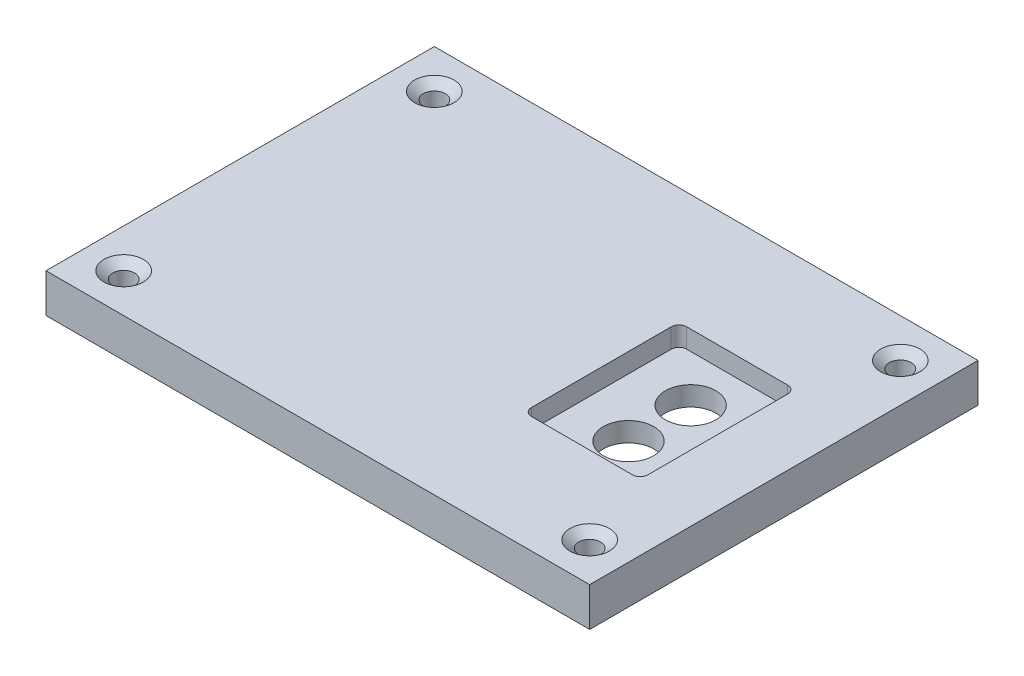
ISO-10303-21;
HEADER;
FILE_DESCRIPTION(('STEP AP214'),'2;1');
FILE_NAME('part.step','',(''),(''),'','','');
FILE_SCHEMA(('AUTOMOTIVE_DESIGN { 1 0 10303 214 1 1 1 1 }'));
ENDSEC;
DATA;
#1=APPLICATION_CONTEXT('core data for automotive mechanical design processes');
#2=APPLICATION_PROTOCOL_DEFINITION('international standard','automotive_design',2000,#1);
#3=PRODUCT_CONTEXT('',#1,'mechanical');
#4=PRODUCT('Part','Part','',(#3));
#5=PRODUCT_RELATED_PRODUCT_CATEGORY('part','',(#4));
#6=PRODUCT_DEFINITION_FORMATION('','',#4);
#7=PRODUCT_DEFINITION_CONTEXT('part definition',#1,'design');
#8=PRODUCT_DEFINITION('design','',#6,#7);
#9=PRODUCT_DEFINITION_SHAPE('','',#8);
#10=(LENGTH_UNIT() NAMED_UNIT(*) SI_UNIT(.MILLI.,.METRE.));
#11=(NAMED_UNIT(*) PLANE_ANGLE_UNIT() SI_UNIT($,.RADIAN.));
#12=(NAMED_UNIT(*) SI_UNIT($,.STERADIAN.) SOLID_ANGLE_UNIT());
#13=UNCERTAINTY_MEASURE_WITH_UNIT(LENGTH_MEASURE(1.E-05),#10,'distance_accuracy_value','');
#14=(GEOMETRIC_REPRESENTATION_CONTEXT(3) GLOBAL_UNCERTAINTY_ASSIGNED_CONTEXT((#13)) GLOBAL_UNIT_ASSIGNED_CONTEXT((#10,
#11,#12)) REPRESENTATION_CONTEXT('',''));
#15=CARTESIAN_POINT('',(0.,0.,0.));
#16=DIRECTION('',(0.,0.,1.));
#17=DIRECTION('',(1.,0.,0.));
#18=AXIS2_PLACEMENT_3D('',#15,#16,#17);
#19=CARTESIAN_POINT('',(0.,12.7,0.));
#20=DIRECTION('',(0.,-1.,0.));
#21=DIRECTION('',(0.,0.,-1.));
#22=AXIS2_PLACEMENT_3D('',#19,#20,#21);
#23=PLANE('',#22);
#24=DIRECTION('',(0.,0.,-1.));
#25=VECTOR('',#24,1.);
#26=CARTESIAN_POINT('',(88.9,12.7,63.5));
#27=LINE('',#26,#25);
#28=CARTESIAN_POINT('',(88.9,12.7,63.5));
#29=VERTEX_POINT('',#28);
#30=CARTESIAN_POINT('',(88.9,12.7,-63.5));
#31=VERTEX_POINT('',#30);
#32=EDGE_CURVE('E133',#29,#31,#27,.T.);
#33=ORIENTED_EDGE('',*,*,#32,.T.);
#34=DIRECTION('',(-1.,0.,0.));
#35=VECTOR('',#34,1.);
#36=CARTESIAN_POINT('',(-88.9,12.7,-63.5));
#37=LINE('',#36,#35);
#38=CARTESIAN_POINT('',(-88.9,12.7,-63.5));
#39=VERTEX_POINT('',#38);
#40=EDGE_CURVE('E122',#31,#39,#37,.T.);
#41=ORIENTED_EDGE('',*,*,#40,.T.);
#42=DIRECTION('',(0.,0.,1.));
#43=VECTOR('',#42,1.);
#44=CARTESIAN_POINT('',(-88.9,12.7,63.5));
#45=LINE('',#44,#43);
#46=CARTESIAN_POINT('',(-88.9,12.7,63.5));
#47=VERTEX_POINT('',#46);
#48=EDGE_CURVE('E132',#39,#47,#45,.T.);
#49=ORIENTED_EDGE('',*,*,#48,.T.);
#50=DIRECTION('',(1.,0.,0.));
#51=VECTOR('',#50,1.);
#52=CARTESIAN_POINT('',(-88.9,12.7,63.5));
#53=LINE('',#52,#51);
#54=EDGE_CURVE('E138',#47,#29,#53,.T.);
#55=ORIENTED_EDGE('',*,*,#54,.T.);
#56=EDGE_LOOP('',(#33,#41,#49,#55));
#57=FACE_BOUND('',#56,.T.);
#58=CARTESIAN_POINT('',(-76.2,12.7,-50.8));
#59=DIRECTION('',(0.,1.,0.));
#60=DIRECTION('',(0.,0.,1.));
#61=AXIS2_PLACEMENT_3D('',#58,#59,#60);
#62=CIRCLE('',#61,6.4389);
#63=CARTESIAN_POINT('',(-76.2,12.7,-44.3611));
#64=VERTEX_POINT('',#63);
#65=EDGE_CURVE('E250',#64,#64,#62,.T.);
#66=ORIENTED_EDGE('',*,*,#65,.F.);
#67=EDGE_LOOP('',(#66));
#68=FACE_BOUND('',#67,.T.);
#69=CARTESIAN_POINT('',(76.2,12.7,-50.8));
#70=DIRECTION('',(0.,1.,0.));
#71=DIRECTION('',(0.,0.,1.));
#72=AXIS2_PLACEMENT_3D('',#69,#70,#71);
#73=CIRCLE('',#72,6.4389);
#74=CARTESIAN_POINT('',(76.2,12.7,-44.3611));
#75=VERTEX_POINT('',#74);
#76=EDGE_CURVE('E241',#75,#75,#73,.T.);
#77=ORIENTED_EDGE('',*,*,#76,.F.);
#78=EDGE_LOOP('',(#77));
#79=FACE_BOUND('',#78,.T.);
#80=CARTESIAN_POINT('',(76.2,12.7,50.8));
#81=DIRECTION('',(0.,1.,0.));
#82=DIRECTION('',(0.,0.,1.));
#83=AXIS2_PLACEMENT_3D('',#80,#81,#82);
#84=CIRCLE('',#83,6.4389);
#85=CARTESIAN_POINT('',(76.2,12.7,57.2389));
#86=VERTEX_POINT('',#85);
#87=EDGE_CURVE('E232',#86,#86,#84,.T.);
#88=ORIENTED_EDGE('',*,*,#87,.F.);
#89=EDGE_LOOP('',(#88));
#90=FACE_BOUND('',#89,.T.);
#91=CARTESIAN_POINT('',(-76.2,12.7,50.8));
#92=DIRECTION('',(0.,1.,0.));
#93=DIRECTION('',(0.,0.,1.));
#94=AXIS2_PLACEMENT_3D('',#91,#92,#93);
#95=CIRCLE('',#94,6.4389);
#96=CARTESIAN_POINT('',(-76.2,12.7,57.2389));
#97=VERTEX_POINT('',#96);
#98=EDGE_CURVE('E211',#97,#97,#95,.T.);
#99=ORIENTED_EDGE('',*,*,#98,.F.);
#100=EDGE_LOOP('',(#99));
#101=FACE_BOUND('',#100,.T.);
#102=DIRECTION('',(0.,0.,1.));
#103=VECTOR('',#102,1.);
#104=CARTESIAN_POINT('',(29.21,12.7,-25.4));
#105=LINE('',#104,#103);
#106=CARTESIAN_POINT('',(29.21,12.7,-22.86));
#107=VERTEX_POINT('',#106);
#108=CARTESIAN_POINT('',(29.21,12.7,22.86));
#109=VERTEX_POINT('',#108);
#110=EDGE_CURVE('E184',#107,#109,#105,.T.);
#111=ORIENTED_EDGE('',*,*,#110,.F.);
#112=CARTESIAN_POINT('',(31.75,12.7,-22.86));
#113=DIRECTION('',(0.,-1.,0.));
#114=DIRECTION('',(0.,0.,-1.));
#115=AXIS2_PLACEMENT_3D('',#112,#113,#114);
#116=CIRCLE('',#115,2.54);
#117=CARTESIAN_POINT('',(31.75,12.7,-25.4));
#118=VERTEX_POINT('',#117);
#119=EDGE_CURVE('E42',#107,#118,#116,.T.);
#120=ORIENTED_EDGE('',*,*,#119,.T.);
#121=DIRECTION('',(1.,0.,0.));
#122=VECTOR('',#121,1.);
#123=CARTESIAN_POINT('',(29.21,12.7,-25.4));
#124=LINE('',#123,#122);
#125=CARTESIAN_POINT('',(64.77,12.7,-25.4));
#126=VERTEX_POINT('',#125);
#127=EDGE_CURVE('E217',#118,#126,#124,.T.);
#128=ORIENTED_EDGE('',*,*,#127,.T.);
#129=CARTESIAN_POINT('',(64.77,12.7,-22.86));
#130=DIRECTION('',(0.,-1.,0.));
#131=DIRECTION('',(0.,0.,-1.));
#132=AXIS2_PLACEMENT_3D('',#129,#130,#131);
#133=CIRCLE('',#132,2.54);
#134=CARTESIAN_POINT('',(67.31,12.7,-22.86));
#135=VERTEX_POINT('',#134);
#136=EDGE_CURVE('E11',#126,#135,#133,.T.);
#137=ORIENTED_EDGE('',*,*,#136,.T.);
#138=DIRECTION('',(0.,0.,1.));
#139=VECTOR('',#138,1.);
#140=CARTESIAN_POINT('',(67.31,12.7,-25.4));
#141=LINE('',#140,#139);
#142=CARTESIAN_POINT('',(67.31,12.7,22.86));
#143=VERTEX_POINT('',#142);
#144=EDGE_CURVE('E219',#135,#143,#141,.T.);
#145=ORIENTED_EDGE('',*,*,#144,.T.);
#146=CARTESIAN_POINT('',(64.77,12.7,22.86));
#147=DIRECTION('',(0.,-1.,0.));
#148=DIRECTION('',(0.,0.,-1.));
#149=AXIS2_PLACEMENT_3D('',#146,#147,#148);
#150=CIRCLE('',#149,2.54);
#151=CARTESIAN_POINT('',(64.77,12.7,25.4));
#152=VERTEX_POINT('',#151);
#153=EDGE_CURVE('E179',#143,#152,#150,.T.);
#154=ORIENTED_EDGE('',*,*,#153,.T.);
#155=DIRECTION('',(1.,0.,0.));
#156=VECTOR('',#155,1.);
#157=CARTESIAN_POINT('',(29.21,12.7,25.4));
#158=LINE('',#157,#156);
#159=CARTESIAN_POINT('',(31.75,12.7,25.4));
#160=VERTEX_POINT('',#159);
#161=EDGE_CURVE('E186',#160,#152,#158,.T.);
#162=ORIENTED_EDGE('',*,*,#161,.F.);
#163=CARTESIAN_POINT('',(31.75,12.7,22.86));
#164=DIRECTION('',(0.,-1.,0.));
#165=DIRECTION('',(0.,0.,-1.));
#166=AXIS2_PLACEMENT_3D('',#163,#164,#165);
#167=CIRCLE('',#166,2.54);
#168=EDGE_CURVE('E181',#160,#109,#167,.T.);
#169=ORIENTED_EDGE('',*,*,#168,.T.);
#170=EDGE_LOOP('',(#111,#120,#128,#137,#145,#154,#162,#169));
#171=FACE_BOUND('',#170,.T.);
#172=ADVANCED_FACE('F34',(#57,#68,#79,#90,#101,#171),#23,.F.);
#173=CARTESIAN_POINT('',(88.9,12.7,63.5));
#174=DIRECTION('',(-1.,0.,0.));
#175=DIRECTION('',(0.,0.,1.));
#176=AXIS2_PLACEMENT_3D('',#173,#174,#175);
#177=PLANE('',#176);
#178=DIRECTION('',(0.,0.,-1.));
#179=VECTOR('',#178,1.);
#180=CARTESIAN_POINT('',(88.9,0.,63.5));
#181=LINE('',#180,#179);
#182=CARTESIAN_POINT('',(88.9,0.,63.5));
#183=VERTEX_POINT('',#182);
#184=CARTESIAN_POINT('',(88.9,0.,-63.5));
#185=VERTEX_POINT('',#184);
#186=EDGE_CURVE('E146',#183,#185,#181,.T.);
#187=ORIENTED_EDGE('',*,*,#186,.T.);
#188=DIRECTION('',(0.,-1.,0.));
#189=VECTOR('',#188,1.);
#190=CARTESIAN_POINT('',(88.9,12.7,-63.5));
#191=LINE('',#190,#189);
#192=EDGE_CURVE('E126',#31,#185,#191,.T.);
#193=ORIENTED_EDGE('',*,*,#192,.F.);
#194=ORIENTED_EDGE('',*,*,#32,.F.);
#195=DIRECTION('',(0.,-1.,0.));
#196=VECTOR('',#195,1.);
#197=CARTESIAN_POINT('',(88.9,12.7,63.5));
#198=LINE('',#197,#196);
#199=EDGE_CURVE('E261',#29,#183,#198,.T.);
#200=ORIENTED_EDGE('',*,*,#199,.T.);
#201=EDGE_LOOP('',(#187,#193,#194,#200));
#202=FACE_BOUND('',#201,.T.);
#203=ADVANCED_FACE('F144',(#202),#177,.F.);
#204=CARTESIAN_POINT('',(-88.9,12.7,-63.5));
#205=DIRECTION('',(0.,0.,1.));
#206=DIRECTION('',(1.,0.,0.));
#207=AXIS2_PLACEMENT_3D('',#204,#205,#206);
#208=PLANE('',#207);
#209=DIRECTION('',(-1.,0.,0.));
#210=VECTOR('',#209,1.);
#211=CARTESIAN_POINT('',(-88.9,0.,-63.5));
#212=LINE('',#211,#210);
#213=CARTESIAN_POINT('',(-88.9,0.,-63.5));
#214=VERTEX_POINT('',#213);
#215=EDGE_CURVE('E263',#185,#214,#212,.T.);
#216=ORIENTED_EDGE('',*,*,#215,.T.);
#217=DIRECTION('',(0.,-1.,0.));
#218=VECTOR('',#217,1.);
#219=CARTESIAN_POINT('',(-88.9,12.7,-63.5));
#220=LINE('',#219,#218);
#221=EDGE_CURVE('E129',#39,#214,#220,.T.);
#222=ORIENTED_EDGE('',*,*,#221,.F.);
#223=ORIENTED_EDGE('',*,*,#40,.F.);
#224=ORIENTED_EDGE('',*,*,#192,.T.);
#225=EDGE_LOOP('',(#216,#222,#223,#224));
#226=FACE_BOUND('',#225,.T.);
#227=ADVANCED_FACE('F124',(#226),#208,.F.);
#228=CARTESIAN_POINT('',(-88.9,12.7,63.5));
#229=DIRECTION('',(1.,0.,0.));
#230=DIRECTION('',(0.,0.,-1.));
#231=AXIS2_PLACEMENT_3D('',#228,#229,#230);
#232=PLANE('',#231);
#233=DIRECTION('',(0.,0.,1.));
#234=VECTOR('',#233,1.);
#235=CARTESIAN_POINT('',(-88.9,0.,63.5));
#236=LINE('',#235,#234);
#237=CARTESIAN_POINT('',(-88.9,0.,63.5));
#238=VERTEX_POINT('',#237);
#239=EDGE_CURVE('E265',#214,#238,#236,.T.);
#240=ORIENTED_EDGE('',*,*,#239,.T.);
#241=DIRECTION('',(0.,-1.,0.));
#242=VECTOR('',#241,1.);
#243=CARTESIAN_POINT('',(-88.9,12.7,63.5));
#244=LINE('',#243,#242);
#245=EDGE_CURVE('E151',#47,#238,#244,.T.);
#246=ORIENTED_EDGE('',*,*,#245,.F.);
#247=ORIENTED_EDGE('',*,*,#48,.F.);
#248=ORIENTED_EDGE('',*,*,#221,.T.);
#249=EDGE_LOOP('',(#240,#246,#247,#248));
#250=FACE_BOUND('',#249,.T.);
#251=ADVANCED_FACE('F277',(#250),#232,.F.);
#252=CARTESIAN_POINT('',(-88.9,12.7,63.5));
#253=DIRECTION('',(0.,0.,-1.));
#254=DIRECTION('',(-1.,0.,0.));
#255=AXIS2_PLACEMENT_3D('',#252,#253,#254);
#256=PLANE('',#255);
#257=DIRECTION('',(1.,0.,0.));
#258=VECTOR('',#257,1.);
#259=CARTESIAN_POINT('',(-88.9,0.,63.5));
#260=LINE('',#259,#258);
#261=EDGE_CURVE('E142',#238,#183,#260,.T.);
#262=ORIENTED_EDGE('',*,*,#261,.T.);
#263=ORIENTED_EDGE('',*,*,#199,.F.);
#264=ORIENTED_EDGE('',*,*,#54,.F.);
#265=ORIENTED_EDGE('',*,*,#245,.T.);
#266=EDGE_LOOP('',(#262,#263,#264,#265));
#267=FACE_BOUND('',#266,.T.);
#268=ADVANCED_FACE('F272',(#267),#256,.F.);
#269=CARTESIAN_POINT('',(0.,0.,0.));
#270=DIRECTION('',(0.,-1.,0.));
#271=DIRECTION('',(0.,0.,-1.));
#272=AXIS2_PLACEMENT_3D('',#269,#270,#271);
#273=PLANE('',#272);
#274=CARTESIAN_POINT('',(48.26,0.,10.16));
#275=DIRECTION('',(0.,-1.,0.));
#276=DIRECTION('',(0.,0.,-1.));
#277=AXIS2_PLACEMENT_3D('',#274,#275,#276);
#278=CIRCLE('',#277,8.255);
#279=CARTESIAN_POINT('',(48.26,0.,1.905));
#280=VERTEX_POINT('',#279);
#281=EDGE_CURVE('E306',#280,#280,#278,.F.);
#282=ORIENTED_EDGE('',*,*,#281,.T.);
#283=EDGE_LOOP('',(#282));
#284=FACE_BOUND('',#283,.T.);
#285=CARTESIAN_POINT('',(48.26,0.,-10.16));
#286=DIRECTION('',(0.,-1.,0.));
#287=DIRECTION('',(0.,0.,-1.));
#288=AXIS2_PLACEMENT_3D('',#285,#286,#287);
#289=CIRCLE('',#288,8.25499999999999);
#290=CARTESIAN_POINT('',(48.26,0.,-18.415));
#291=VERTEX_POINT('',#290);
#292=EDGE_CURVE('E310',#291,#291,#289,.F.);
#293=ORIENTED_EDGE('',*,*,#292,.T.);
#294=EDGE_LOOP('',(#293));
#295=FACE_BOUND('',#294,.T.);
#296=CARTESIAN_POINT('',(-76.2,0.,50.8));
#297=DIRECTION('',(0.,-1.,0.));
#298=DIRECTION('',(0.,0.,-1.));
#299=AXIS2_PLACEMENT_3D('',#296,#297,#298);
#300=CIRCLE('',#299,3.57124);
#301=CARTESIAN_POINT('',(-76.2,0.,47.22876));
#302=VERTEX_POINT('',#301);
#303=EDGE_CURVE('E229',#302,#302,#300,.T.);
#304=ORIENTED_EDGE('',*,*,#303,.F.);
#305=EDGE_LOOP('',(#304));
#306=FACE_BOUND('',#305,.T.);
#307=CARTESIAN_POINT('',(76.2,0.,50.8));
#308=DIRECTION('',(0.,-1.,0.));
#309=DIRECTION('',(0.,0.,-1.));
#310=AXIS2_PLACEMENT_3D('',#307,#308,#309);
#311=CIRCLE('',#310,3.57124);
#312=CARTESIAN_POINT('',(76.2,0.,47.22876));
#313=VERTEX_POINT('',#312);
#314=EDGE_CURVE('E238',#313,#313,#311,.T.);
#315=ORIENTED_EDGE('',*,*,#314,.F.);
#316=EDGE_LOOP('',(#315));
#317=FACE_BOUND('',#316,.T.);
#318=CARTESIAN_POINT('',(76.2,0.,-50.8));
#319=DIRECTION('',(0.,-1.,0.));
#320=DIRECTION('',(0.,0.,-1.));
#321=AXIS2_PLACEMENT_3D('',#318,#319,#320);
#322=CIRCLE('',#321,3.57124);
#323=CARTESIAN_POINT('',(76.2,0.,-54.37124));
#324=VERTEX_POINT('',#323);
#325=EDGE_CURVE('E247',#324,#324,#322,.T.);
#326=ORIENTED_EDGE('',*,*,#325,.F.);
#327=EDGE_LOOP('',(#326));
#328=FACE_BOUND('',#327,.T.);
#329=CARTESIAN_POINT('',(-76.2,0.,-50.8));
#330=DIRECTION('',(0.,-1.,0.));
#331=DIRECTION('',(0.,0.,-1.));
#332=AXIS2_PLACEMENT_3D('',#329,#330,#331);
#333=CIRCLE('',#332,3.57124);
#334=CARTESIAN_POINT('',(-76.2,0.,-54.37124));
#335=VERTEX_POINT('',#334);
#336=EDGE_CURVE('E256',#335,#335,#333,.T.);
#337=ORIENTED_EDGE('',*,*,#336,.F.);
#338=EDGE_LOOP('',(#337));
#339=FACE_BOUND('',#338,.T.);
#340=ORIENTED_EDGE('',*,*,#186,.F.);
#341=ORIENTED_EDGE('',*,*,#261,.F.);
#342=ORIENTED_EDGE('',*,*,#239,.F.);
#343=ORIENTED_EDGE('',*,*,#215,.F.);
#344=EDGE_LOOP('',(#340,#341,#342,#343));
#345=FACE_BOUND('',#344,.T.);
#346=ADVANCED_FACE('F276',(#284,#295,#306,#317,#328,#339,#345),#273,.T.);
#347=CARTESIAN_POINT('',(-76.2,12.7,-50.8));
#348=DIRECTION('',(0.,1.,0.));
#349=DIRECTION('',(0.,0.,1.));
#350=AXIS2_PLACEMENT_3D('',#347,#348,#349);
#351=CYLINDRICAL_SURFACE('',#350,3.57124);
#352=CARTESIAN_POINT('',(-76.2,10.2937475516582,-50.8));
#353=DIRECTION('',(0.,1.,0.));
#354=DIRECTION('',(0.,0.,1.));
#355=AXIS2_PLACEMENT_3D('',#352,#353,#354);
#356=CIRCLE('',#355,3.57124);
#357=CARTESIAN_POINT('',(-76.2,10.2937475516582,-47.22876));
#358=VERTEX_POINT('',#357);
#359=EDGE_CURVE('E253',#358,#358,#356,.T.);
#360=ORIENTED_EDGE('',*,*,#359,.T.);
#361=EDGE_LOOP('',(#360));
#362=FACE_BOUND('',#361,.T.);
#363=ORIENTED_EDGE('',*,*,#336,.T.);
#364=EDGE_LOOP('',(#363));
#365=FACE_BOUND('',#364,.T.);
#366=ADVANCED_FACE('F294',(#362,#365),#351,.F.);
#367=CARTESIAN_POINT('',(-76.2,12.7,-50.8));
#368=DIRECTION('',(0.,1.,0.));
#369=DIRECTION('',(0.,0.,1.));
#370=AXIS2_PLACEMENT_3D('',#367,#368,#369);
#371=CONICAL_SURFACE('',#370,6.4389,0.872664625997163);
#372=ORIENTED_EDGE('',*,*,#359,.F.);
#373=EDGE_LOOP('',(#372));
#374=FACE_BOUND('',#373,.T.);
#375=ORIENTED_EDGE('',*,*,#65,.T.);
#376=EDGE_LOOP('',(#375));
#377=FACE_BOUND('',#376,.T.);
#378=ADVANCED_FACE('F301',(#374,#377),#371,.F.);
#379=CARTESIAN_POINT('',(76.2,12.7,-50.8));
#380=DIRECTION('',(0.,1.,0.));
#381=DIRECTION('',(0.,0.,1.));
#382=AXIS2_PLACEMENT_3D('',#379,#380,#381);
#383=CYLINDRICAL_SURFACE('',#382,3.57124);
#384=CARTESIAN_POINT('',(76.2,10.2937475516582,-50.8));
#385=DIRECTION('',(0.,1.,0.));
#386=DIRECTION('',(0.,0.,1.));
#387=AXIS2_PLACEMENT_3D('',#384,#385,#386);
#388=CIRCLE('',#387,3.57124);
#389=CARTESIAN_POINT('',(76.2,10.2937475516582,-47.22876));
#390=VERTEX_POINT('',#389);
#391=EDGE_CURVE('E244',#390,#390,#388,.T.);
#392=ORIENTED_EDGE('',*,*,#391,.T.);
#393=EDGE_LOOP('',(#392));
#394=FACE_BOUND('',#393,.T.);
#395=ORIENTED_EDGE('',*,*,#325,.T.);
#396=EDGE_LOOP('',(#395));
#397=FACE_BOUND('',#396,.T.);
#398=ADVANCED_FACE('F320',(#394,#397),#383,.F.);
#399=CARTESIAN_POINT('',(76.2,12.7,-50.8));
#400=DIRECTION('',(0.,1.,0.));
#401=DIRECTION('',(0.,0.,1.));
#402=AXIS2_PLACEMENT_3D('',#399,#400,#401);
#403=CONICAL_SURFACE('',#402,6.4389,0.872664625997163);
#404=ORIENTED_EDGE('',*,*,#391,.F.);
#405=EDGE_LOOP('',(#404));
#406=FACE_BOUND('',#405,.T.);
#407=ORIENTED_EDGE('',*,*,#76,.T.);
#408=EDGE_LOOP('',(#407));
#409=FACE_BOUND('',#408,.T.);
#410=ADVANCED_FACE('F322',(#406,#409),#403,.F.);
#411=CARTESIAN_POINT('',(76.2,12.7,50.8));
#412=DIRECTION('',(0.,1.,0.));
#413=DIRECTION('',(0.,0.,1.));
#414=AXIS2_PLACEMENT_3D('',#411,#412,#413);
#415=CYLINDRICAL_SURFACE('',#414,3.57124);
#416=CARTESIAN_POINT('',(76.2,10.2937475516582,50.8));
#417=DIRECTION('',(0.,1.,0.));
#418=DIRECTION('',(0.,0.,1.));
#419=AXIS2_PLACEMENT_3D('',#416,#417,#418);
#420=CIRCLE('',#419,3.57124);
#421=CARTESIAN_POINT('',(76.2,10.2937475516582,54.37124));
#422=VERTEX_POINT('',#421);
#423=EDGE_CURVE('E235',#422,#422,#420,.T.);
#424=ORIENTED_EDGE('',*,*,#423,.T.);
#425=EDGE_LOOP('',(#424));
#426=FACE_BOUND('',#425,.T.);
#427=ORIENTED_EDGE('',*,*,#314,.T.);
#428=EDGE_LOOP('',(#427));
#429=FACE_BOUND('',#428,.T.);
#430=ADVANCED_FACE('F329',(#426,#429),#415,.F.);
#431=CARTESIAN_POINT('',(76.2,12.7,50.8));
#432=DIRECTION('',(0.,1.,0.));
#433=DIRECTION('',(0.,0.,1.));
#434=AXIS2_PLACEMENT_3D('',#431,#432,#433);
#435=CONICAL_SURFACE('',#434,6.4389,0.872664625997163);
#436=ORIENTED_EDGE('',*,*,#423,.F.);
#437=EDGE_LOOP('',(#436));
#438=FACE_BOUND('',#437,.T.);
#439=ORIENTED_EDGE('',*,*,#87,.T.);
#440=EDGE_LOOP('',(#439));
#441=FACE_BOUND('',#440,.T.);
#442=ADVANCED_FACE('F336',(#438,#441),#435,.F.);
#443=CARTESIAN_POINT('',(-76.2,12.7,50.8));
#444=DIRECTION('',(0.,1.,0.));
#445=DIRECTION('',(0.,0.,1.));
#446=AXIS2_PLACEMENT_3D('',#443,#444,#445);
#447=CYLINDRICAL_SURFACE('',#446,3.57124);
#448=CARTESIAN_POINT('',(-76.2,10.2937475516582,50.8));
#449=DIRECTION('',(0.,1.,0.));
#450=DIRECTION('',(0.,0.,1.));
#451=AXIS2_PLACEMENT_3D('',#448,#449,#450);
#452=CIRCLE('',#451,3.57124);
#453=CARTESIAN_POINT('',(-76.2,10.2937475516582,54.37124));
#454=VERTEX_POINT('',#453);
#455=EDGE_CURVE('E226',#454,#454,#452,.T.);
#456=ORIENTED_EDGE('',*,*,#455,.T.);
#457=EDGE_LOOP('',(#456));
#458=FACE_BOUND('',#457,.T.);
#459=ORIENTED_EDGE('',*,*,#303,.T.);
#460=EDGE_LOOP('',(#459));
#461=FACE_BOUND('',#460,.T.);
#462=ADVANCED_FACE('F340',(#458,#461),#447,.F.);
#463=CARTESIAN_POINT('',(-76.2,12.7,50.8));
#464=DIRECTION('',(0.,1.,0.));
#465=DIRECTION('',(0.,0.,1.));
#466=AXIS2_PLACEMENT_3D('',#463,#464,#465);
#467=CONICAL_SURFACE('',#466,6.4389,0.872664625997163);
#468=ORIENTED_EDGE('',*,*,#455,.F.);
#469=EDGE_LOOP('',(#468));
#470=FACE_BOUND('',#469,.T.);
#471=ORIENTED_EDGE('',*,*,#98,.T.);
#472=EDGE_LOOP('',(#471));
#473=FACE_BOUND('',#472,.T.);
#474=ADVANCED_FACE('F344',(#470,#473),#467,.F.);
#475=CARTESIAN_POINT('',(29.21,6.35,-25.4));
#476=DIRECTION('',(0.,0.,1.));
#477=DIRECTION('',(1.,0.,0.));
#478=AXIS2_PLACEMENT_3D('',#475,#476,#477);
#479=PLANE('',#478);
#480=ORIENTED_EDGE('',*,*,#127,.F.);
#481=DIRECTION('',(0.,1.,0.));
#482=VECTOR('',#481,1.);
#483=CARTESIAN_POINT('',(31.75,6.35,-25.4));
#484=LINE('',#483,#482);
#485=CARTESIAN_POINT('',(31.75,6.35,-25.4));
#486=VERTEX_POINT('',#485);
#487=EDGE_CURVE('E177',#118,#486,#484,.F.);
#488=ORIENTED_EDGE('',*,*,#487,.T.);
#489=DIRECTION('',(1.,0.,0.));
#490=VECTOR('',#489,1.);
#491=CARTESIAN_POINT('',(29.21,6.35,-25.4));
#492=LINE('',#491,#490);
#493=CARTESIAN_POINT('',(64.77,6.35,-25.4));
#494=VERTEX_POINT('',#493);
#495=EDGE_CURVE('E195',#486,#494,#492,.T.);
#496=ORIENTED_EDGE('',*,*,#495,.T.);
#497=DIRECTION('',(0.,1.,0.));
#498=VECTOR('',#497,1.);
#499=CARTESIAN_POINT('',(64.77,12.7,-25.4));
#500=LINE('',#499,#498);
#501=EDGE_CURVE('E175',#494,#126,#500,.T.);
#502=ORIENTED_EDGE('',*,*,#501,.T.);
#503=EDGE_LOOP('',(#480,#488,#496,#502));
#504=FACE_BOUND('',#503,.T.);
#505=ADVANCED_FACE('F348',(#504),#479,.T.);
#506=CARTESIAN_POINT('',(67.31,6.35,-25.4));
#507=DIRECTION('',(-1.,0.,0.));
#508=DIRECTION('',(0.,0.,1.));
#509=AXIS2_PLACEMENT_3D('',#506,#507,#508);
#510=PLANE('',#509);
#511=DIRECTION('',(0.,0.,1.));
#512=VECTOR('',#511,1.);
#513=CARTESIAN_POINT('',(67.31,6.35,-25.4));
#514=LINE('',#513,#512);
#515=CARTESIAN_POINT('',(67.31,6.35,-22.86));
#516=VERTEX_POINT('',#515);
#517=CARTESIAN_POINT('',(67.31,6.35,22.86));
#518=VERTEX_POINT('',#517);
#519=EDGE_CURVE('E209',#516,#518,#514,.T.);
#520=ORIENTED_EDGE('',*,*,#519,.T.);
#521=DIRECTION('',(0.,1.,0.));
#522=VECTOR('',#521,1.);
#523=CARTESIAN_POINT('',(67.31,6.35,22.86));
#524=LINE('',#523,#522);
#525=EDGE_CURVE('E149',#518,#143,#524,.T.);
#526=ORIENTED_EDGE('',*,*,#525,.T.);
#527=ORIENTED_EDGE('',*,*,#144,.F.);
#528=DIRECTION('',(0.,1.,0.));
#529=VECTOR('',#528,1.);
#530=CARTESIAN_POINT('',(67.31,6.35,-22.86));
#531=LINE('',#530,#529);
#532=EDGE_CURVE('E147',#135,#516,#531,.F.);
#533=ORIENTED_EDGE('',*,*,#532,.T.);
#534=EDGE_LOOP('',(#520,#526,#527,#533));
#535=FACE_BOUND('',#534,.T.);
#536=ADVANCED_FACE('F352',(#535),#510,.T.);
#537=CARTESIAN_POINT('',(29.21,6.35,25.4));
#538=DIRECTION('',(0.,0.,1.));
#539=DIRECTION('',(1.,0.,0.));
#540=AXIS2_PLACEMENT_3D('',#537,#538,#539);
#541=PLANE('',#540);
#542=ORIENTED_EDGE('',*,*,#161,.T.);
#543=DIRECTION('',(0.,1.,0.));
#544=VECTOR('',#543,1.);
#545=CARTESIAN_POINT('',(64.77,6.35,25.4));
#546=LINE('',#545,#544);
#547=CARTESIAN_POINT('',(64.77,6.35,25.4));
#548=VERTEX_POINT('',#547);
#549=EDGE_CURVE('E160',#152,#548,#546,.F.);
#550=ORIENTED_EDGE('',*,*,#549,.T.);
#551=DIRECTION('',(1.,0.,0.));
#552=VECTOR('',#551,1.);
#553=CARTESIAN_POINT('',(29.21,6.35,25.4));
#554=LINE('',#553,#552);
#555=CARTESIAN_POINT('',(31.75,6.35,25.4));
#556=VERTEX_POINT('',#555);
#557=EDGE_CURVE('E203',#556,#548,#554,.T.);
#558=ORIENTED_EDGE('',*,*,#557,.F.);
#559=DIRECTION('',(0.,1.,0.));
#560=VECTOR('',#559,1.);
#561=CARTESIAN_POINT('',(31.75,12.7,25.4));
#562=LINE('',#561,#560);
#563=EDGE_CURVE('E157',#556,#160,#562,.T.);
#564=ORIENTED_EDGE('',*,*,#563,.T.);
#565=EDGE_LOOP('',(#542,#550,#558,#564));
#566=FACE_BOUND('',#565,.T.);
#567=ADVANCED_FACE('F207',(#566),#541,.F.);
#568=CARTESIAN_POINT('',(29.21,6.35,-25.4));
#569=DIRECTION('',(-1.,0.,0.));
#570=DIRECTION('',(0.,0.,1.));
#571=AXIS2_PLACEMENT_3D('',#568,#569,#570);
#572=PLANE('',#571);
#573=ORIENTED_EDGE('',*,*,#110,.T.);
#574=DIRECTION('',(0.,1.,0.));
#575=VECTOR('',#574,1.);
#576=CARTESIAN_POINT('',(29.21,6.35,22.86));
#577=LINE('',#576,#575);
#578=CARTESIAN_POINT('',(29.21,6.35,22.86));
#579=VERTEX_POINT('',#578);
#580=EDGE_CURVE('E173',#109,#579,#577,.F.);
#581=ORIENTED_EDGE('',*,*,#580,.T.);
#582=DIRECTION('',(0.,0.,1.));
#583=VECTOR('',#582,1.);
#584=CARTESIAN_POINT('',(29.21,6.35,-25.4));
#585=LINE('',#584,#583);
#586=CARTESIAN_POINT('',(29.21,6.35,-22.86));
#587=VERTEX_POINT('',#586);
#588=EDGE_CURVE('E205',#587,#579,#585,.T.);
#589=ORIENTED_EDGE('',*,*,#588,.F.);
#590=DIRECTION('',(0.,1.,0.));
#591=VECTOR('',#590,1.);
#592=CARTESIAN_POINT('',(29.21,6.35,-22.86));
#593=LINE('',#592,#591);
#594=EDGE_CURVE('E170',#587,#107,#593,.T.);
#595=ORIENTED_EDGE('',*,*,#594,.T.);
#596=EDGE_LOOP('',(#573,#581,#589,#595));
#597=FACE_BOUND('',#596,.T.);
#598=ADVANCED_FACE('F191',(#597),#572,.F.);
#599=CARTESIAN_POINT('',(0.,6.35,0.));
#600=DIRECTION('',(0.,-1.,0.));
#601=DIRECTION('',(0.,0.,-1.));
#602=AXIS2_PLACEMENT_3D('',#599,#600,#601);
#603=PLANE('',#602);
#604=CARTESIAN_POINT('',(48.26,6.35,10.16));
#605=DIRECTION('',(0.,1.,0.));
#606=DIRECTION('',(0.,0.,1.));
#607=AXIS2_PLACEMENT_3D('',#604,#605,#606);
#608=CIRCLE('',#607,8.255);
#609=CARTESIAN_POINT('',(48.26,6.35,18.415));
#610=VERTEX_POINT('',#609);
#611=EDGE_CURVE('E380',#610,#610,#608,.T.);
#612=ORIENTED_EDGE('',*,*,#611,.F.);
#613=EDGE_LOOP('',(#612));
#614=FACE_BOUND('',#613,.T.);
#615=CARTESIAN_POINT('',(48.26,6.35,-10.16));
#616=DIRECTION('',(0.,1.,0.));
#617=DIRECTION('',(0.,0.,1.));
#618=AXIS2_PLACEMENT_3D('',#615,#616,#617);
#619=CIRCLE('',#618,8.25499999999999);
#620=CARTESIAN_POINT('',(48.26,6.35,-1.90500000000001));
#621=VERTEX_POINT('',#620);
#622=EDGE_CURVE('E220',#621,#621,#619,.T.);
#623=ORIENTED_EDGE('',*,*,#622,.F.);
#624=EDGE_LOOP('',(#623));
#625=FACE_BOUND('',#624,.T.);
#626=ORIENTED_EDGE('',*,*,#557,.T.);
#627=CARTESIAN_POINT('',(64.77,6.35,22.86));
#628=DIRECTION('',(0.,-1.,0.));
#629=DIRECTION('',(0.,0.,-1.));
#630=AXIS2_PLACEMENT_3D('',#627,#628,#629);
#631=CIRCLE('',#630,2.54);
#632=EDGE_CURVE('E168',#548,#518,#631,.F.);
#633=ORIENTED_EDGE('',*,*,#632,.T.);
#634=ORIENTED_EDGE('',*,*,#519,.F.);
#635=CARTESIAN_POINT('',(64.77,6.35,-22.86));
#636=DIRECTION('',(0.,-1.,0.));
#637=DIRECTION('',(0.,0.,-1.));
#638=AXIS2_PLACEMENT_3D('',#635,#636,#637);
#639=CIRCLE('',#638,2.54);
#640=EDGE_CURVE('E162',#516,#494,#639,.F.);
#641=ORIENTED_EDGE('',*,*,#640,.T.);
#642=ORIENTED_EDGE('',*,*,#495,.F.);
#643=CARTESIAN_POINT('',(31.75,6.35,-22.86));
#644=DIRECTION('',(0.,-1.,0.));
#645=DIRECTION('',(0.,0.,-1.));
#646=AXIS2_PLACEMENT_3D('',#643,#644,#645);
#647=CIRCLE('',#646,2.54);
#648=EDGE_CURVE('E164',#486,#587,#647,.F.);
#649=ORIENTED_EDGE('',*,*,#648,.T.);
#650=ORIENTED_EDGE('',*,*,#588,.T.);
#651=CARTESIAN_POINT('',(31.75,6.35,22.86));
#652=DIRECTION('',(0.,-1.,0.));
#653=DIRECTION('',(0.,0.,-1.));
#654=AXIS2_PLACEMENT_3D('',#651,#652,#653);
#655=CIRCLE('',#654,2.54);
#656=EDGE_CURVE('E166',#579,#556,#655,.F.);
#657=ORIENTED_EDGE('',*,*,#656,.T.);
#658=EDGE_LOOP('',(#626,#633,#634,#641,#642,#649,#650,#657));
#659=FACE_BOUND('',#658,.T.);
#660=ADVANCED_FACE('F202',(#614,#625,#659),#603,.F.);
#661=CARTESIAN_POINT('',(48.26,-0.00100000000000013,-10.16));
#662=DIRECTION('',(0.,1.,0.));
#663=DIRECTION('',(0.,0.,1.));
#664=AXIS2_PLACEMENT_3D('',#661,#662,#663);
#665=CYLINDRICAL_SURFACE('',#664,8.25499999999999);
#666=ORIENTED_EDGE('',*,*,#292,.F.);
#667=EDGE_LOOP('',(#666));
#668=FACE_BOUND('',#667,.T.);
#669=ORIENTED_EDGE('',*,*,#622,.T.);
#670=EDGE_LOOP('',(#669));
#671=FACE_BOUND('',#670,.T.);
#672=ADVANCED_FACE('F363',(#668,#671),#665,.F.);
#673=CARTESIAN_POINT('',(48.26,-0.00100000000000013,10.16));
#674=DIRECTION('',(0.,1.,0.));
#675=DIRECTION('',(0.,0.,1.));
#676=AXIS2_PLACEMENT_3D('',#673,#674,#675);
#677=CYLINDRICAL_SURFACE('',#676,8.255);
#678=ORIENTED_EDGE('',*,*,#281,.F.);
#679=EDGE_LOOP('',(#678));
#680=FACE_BOUND('',#679,.T.);
#681=ORIENTED_EDGE('',*,*,#611,.T.);
#682=EDGE_LOOP('',(#681));
#683=FACE_BOUND('',#682,.T.);
#684=ADVANCED_FACE('F367',(#680,#683),#677,.F.);
#685=CARTESIAN_POINT('',(64.77,6.35,22.86));
#686=DIRECTION('',(0.,1.,0.));
#687=DIRECTION('',(0.,0.,1.));
#688=AXIS2_PLACEMENT_3D('',#685,#686,#687);
#689=CYLINDRICAL_SURFACE('',#688,2.54);
#690=ORIENTED_EDGE('',*,*,#632,.F.);
#691=ORIENTED_EDGE('',*,*,#549,.F.);
#692=ORIENTED_EDGE('',*,*,#153,.F.);
#693=ORIENTED_EDGE('',*,*,#525,.F.);
#694=EDGE_LOOP('',(#690,#691,#692,#693));
#695=FACE_BOUND('',#694,.T.);
#696=ADVANCED_FACE('F370',(#695),#689,.F.);
#697=CARTESIAN_POINT('',(31.75,6.35,22.86));
#698=DIRECTION('',(0.,-1.,0.));
#699=DIRECTION('',(0.,0.,-1.));
#700=AXIS2_PLACEMENT_3D('',#697,#698,#699);
#701=CYLINDRICAL_SURFACE('',#700,2.54);
#702=ORIENTED_EDGE('',*,*,#656,.F.);
#703=ORIENTED_EDGE('',*,*,#580,.F.);
#704=ORIENTED_EDGE('',*,*,#168,.F.);
#705=ORIENTED_EDGE('',*,*,#563,.F.);
#706=EDGE_LOOP('',(#702,#703,#704,#705));
#707=FACE_BOUND('',#706,.T.);
#708=ADVANCED_FACE('F198',(#707),#701,.F.);
#709=CARTESIAN_POINT('',(31.75,6.35,-22.86));
#710=DIRECTION('',(0.,1.,0.));
#711=DIRECTION('',(0.,0.,1.));
#712=AXIS2_PLACEMENT_3D('',#709,#710,#711);
#713=CYLINDRICAL_SURFACE('',#712,2.54);
#714=ORIENTED_EDGE('',*,*,#648,.F.);
#715=ORIENTED_EDGE('',*,*,#487,.F.);
#716=ORIENTED_EDGE('',*,*,#119,.F.);
#717=ORIENTED_EDGE('',*,*,#594,.F.);
#718=EDGE_LOOP('',(#714,#715,#716,#717));
#719=FACE_BOUND('',#718,.T.);
#720=ADVANCED_FACE('F395',(#719),#713,.F.);
#721=CARTESIAN_POINT('',(64.77,6.35,-22.86));
#722=DIRECTION('',(0.,-1.,0.));
#723=DIRECTION('',(0.,0.,-1.));
#724=AXIS2_PLACEMENT_3D('',#721,#722,#723);
#725=CYLINDRICAL_SURFACE('',#724,2.54);
#726=ORIENTED_EDGE('',*,*,#640,.F.);
#727=ORIENTED_EDGE('',*,*,#532,.F.);
#728=ORIENTED_EDGE('',*,*,#136,.F.);
#729=ORIENTED_EDGE('',*,*,#501,.F.);
#730=EDGE_LOOP('',(#726,#727,#728,#729));
#731=FACE_BOUND('',#730,.T.);
#732=ADVANCED_FACE('F36',(#731),#725,.F.);
#733=CLOSED_SHELL('',(#172,#203,#227,#251,#268,#346,#366,#378,#398,#410,#430,#442,#462,#474,
#505,#536,#567,#598,#660,#672,#684,#696,#708,#720,#732));
#734=MANIFOLD_SOLID_BREP('B2',#733);
#735=ADVANCED_BREP_SHAPE_REPRESENTATION('',(#18,#734),#14);
#736=SHAPE_DEFINITION_REPRESENTATION(#9,#735);
ENDSEC;
END-ISO-10303-21;
